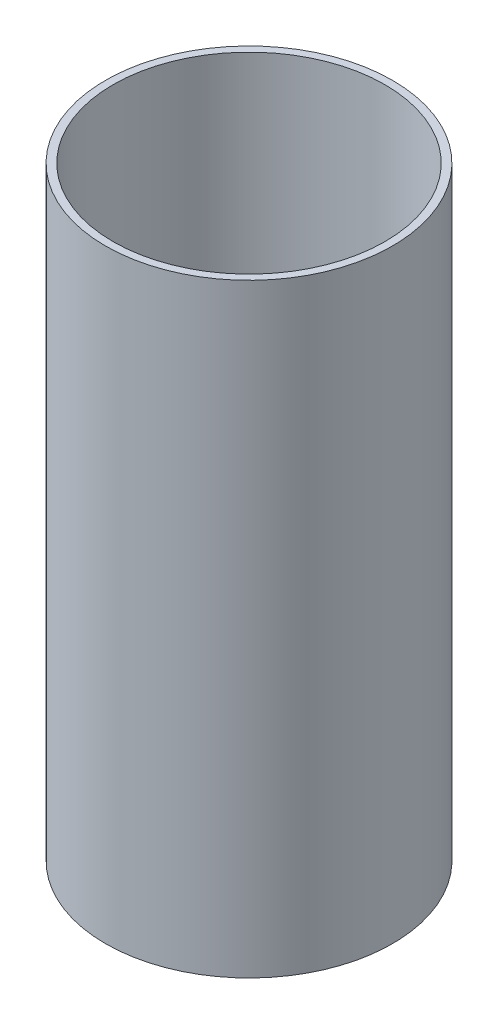
ISO-10303-21;
HEADER;
FILE_DESCRIPTION(('STEP AP214'),'2;1');
FILE_NAME('part.step','',(''),(''),'','','');
FILE_SCHEMA(('AUTOMOTIVE_DESIGN { 1 0 10303 214 1 1 1 1 }'));
ENDSEC;
DATA;
#1=APPLICATION_CONTEXT('core data for automotive mechanical design processes');
#2=APPLICATION_PROTOCOL_DEFINITION('international standard','automotive_design',2000,#1);
#3=PRODUCT_CONTEXT('',#1,'mechanical');
#4=PRODUCT('Part','Part','',(#3));
#5=PRODUCT_RELATED_PRODUCT_CATEGORY('part','',(#4));
#6=PRODUCT_DEFINITION_FORMATION('','',#4);
#7=PRODUCT_DEFINITION_CONTEXT('part definition',#1,'design');
#8=PRODUCT_DEFINITION('design','',#6,#7);
#9=PRODUCT_DEFINITION_SHAPE('','',#8);
#10=(LENGTH_UNIT() NAMED_UNIT(*) SI_UNIT(.MILLI.,.METRE.));
#11=(NAMED_UNIT(*) PLANE_ANGLE_UNIT() SI_UNIT($,.RADIAN.));
#12=(NAMED_UNIT(*) SI_UNIT($,.STERADIAN.) SOLID_ANGLE_UNIT());
#13=UNCERTAINTY_MEASURE_WITH_UNIT(LENGTH_MEASURE(1.E-05),#10,'distance_accuracy_value','');
#14=(GEOMETRIC_REPRESENTATION_CONTEXT(3) GLOBAL_UNCERTAINTY_ASSIGNED_CONTEXT((#13)) GLOBAL_UNIT_ASSIGNED_CONTEXT((#10,
#11,#12)) REPRESENTATION_CONTEXT('',''));
#15=CARTESIAN_POINT('',(0.,0.,0.));
#16=DIRECTION('',(0.,0.,1.));
#17=DIRECTION('',(1.,0.,0.));
#18=AXIS2_PLACEMENT_3D('',#15,#16,#17);
#19=CARTESIAN_POINT('',(0.,160.,0.));
#20=DIRECTION('',(0.,1.,0.));
#21=DIRECTION('',(0.,0.,1.));
#22=AXIS2_PLACEMENT_3D('',#19,#20,#21);
#23=PLANE('',#22);
#24=CARTESIAN_POINT('',(0.,160.,0.));
#25=DIRECTION('',(0.,1.,0.));
#26=DIRECTION('',(0.,0.,1.));
#27=AXIS2_PLACEMENT_3D('',#24,#25,#26);
#28=CIRCLE('',#27,38.);
#29=CARTESIAN_POINT('',(0.,160.,38.));
#30=VERTEX_POINT('',#29);
#31=EDGE_CURVE('E10',#30,#30,#28,.T.);
#32=ORIENTED_EDGE('',*,*,#31,.T.);
#33=EDGE_LOOP('',(#32));
#34=FACE_BOUND('',#33,.T.);
#35=CARTESIAN_POINT('',(0.,160.,0.));
#36=DIRECTION('',(0.,1.,0.));
#37=DIRECTION('',(0.,0.,1.));
#38=AXIS2_PLACEMENT_3D('',#35,#36,#37);
#39=CIRCLE('',#38,36.);
#40=CARTESIAN_POINT('',(0.,160.,36.));
#41=VERTEX_POINT('',#40);
#42=EDGE_CURVE('E43',#41,#41,#39,.T.);
#43=ORIENTED_EDGE('',*,*,#42,.F.);
#44=EDGE_LOOP('',(#43));
#45=FACE_BOUND('',#44,.T.);
#46=ADVANCED_FACE('F32',(#34,#45),#23,.T.);
#47=CARTESIAN_POINT('',(0.,0.,0.));
#48=DIRECTION('',(0.,1.,0.));
#49=DIRECTION('',(0.,0.,1.));
#50=AXIS2_PLACEMENT_3D('',#47,#48,#49);
#51=PLANE('',#50);
#52=CARTESIAN_POINT('',(0.,0.,0.));
#53=DIRECTION('',(0.,1.,0.));
#54=DIRECTION('',(0.,0.,1.));
#55=AXIS2_PLACEMENT_3D('',#52,#53,#54);
#56=CIRCLE('',#55,38.);
#57=CARTESIAN_POINT('',(0.,0.,38.));
#58=VERTEX_POINT('',#57);
#59=EDGE_CURVE('E36',#58,#58,#56,.T.);
#60=ORIENTED_EDGE('',*,*,#59,.F.);
#61=EDGE_LOOP('',(#60));
#62=FACE_BOUND('',#61,.T.);
#63=CARTESIAN_POINT('',(0.,0.,0.));
#64=DIRECTION('',(0.,1.,0.));
#65=DIRECTION('',(0.,0.,1.));
#66=AXIS2_PLACEMENT_3D('',#63,#64,#65);
#67=CIRCLE('',#66,36.);
#68=CARTESIAN_POINT('',(0.,0.,36.));
#69=VERTEX_POINT('',#68);
#70=EDGE_CURVE('E45',#69,#69,#67,.T.);
#71=ORIENTED_EDGE('',*,*,#70,.T.);
#72=EDGE_LOOP('',(#71));
#73=FACE_BOUND('',#72,.T.);
#74=ADVANCED_FACE('F55',(#62,#73),#51,.F.);
#75=CARTESIAN_POINT('',(0.,160.,0.));
#76=DIRECTION('',(0.,-1.,0.));
#77=DIRECTION('',(0.,0.,-1.));
#78=AXIS2_PLACEMENT_3D('',#75,#76,#77);
#79=CYLINDRICAL_SURFACE('',#78,38.);
#80=ORIENTED_EDGE('',*,*,#31,.F.);
#81=EDGE_LOOP('',(#80));
#82=FACE_BOUND('',#81,.T.);
#83=ORIENTED_EDGE('',*,*,#59,.T.);
#84=EDGE_LOOP('',(#83));
#85=FACE_BOUND('',#84,.T.);
#86=ADVANCED_FACE('F34',(#82,#85),#79,.T.);
#87=CARTESIAN_POINT('',(0.,160.,0.));
#88=DIRECTION('',(0.,-1.,0.));
#89=DIRECTION('',(0.,0.,-1.));
#90=AXIS2_PLACEMENT_3D('',#87,#88,#89);
#91=CYLINDRICAL_SURFACE('',#90,36.);
#92=ORIENTED_EDGE('',*,*,#42,.T.);
#93=EDGE_LOOP('',(#92));
#94=FACE_BOUND('',#93,.T.);
#95=ORIENTED_EDGE('',*,*,#70,.F.);
#96=EDGE_LOOP('',(#95));
#97=FACE_BOUND('',#96,.T.);
#98=ADVANCED_FACE('F51',(#94,#97),#91,.F.);
#99=CLOSED_SHELL('',(#46,#74,#86,#98));
#100=MANIFOLD_SOLID_BREP('B2',#99);
#101=ADVANCED_BREP_SHAPE_REPRESENTATION('',(#18,#100),#14);
#102=SHAPE_DEFINITION_REPRESENTATION(#9,#101);
ENDSEC;
END-ISO-10303-21;
